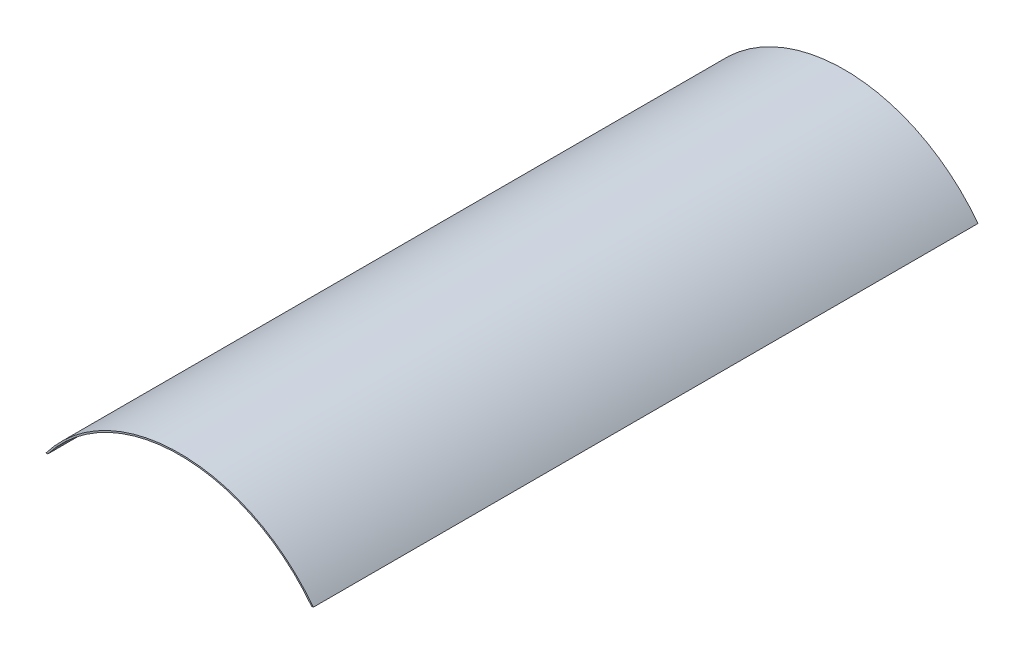
ISO-10303-21;
HEADER;
FILE_DESCRIPTION(('STEP AP214'),'2;1');
FILE_NAME('part.step','',(''),(''),'','','');
FILE_SCHEMA(('AUTOMOTIVE_DESIGN { 1 0 10303 214 1 1 1 1 }'));
ENDSEC;
DATA;
#1=APPLICATION_CONTEXT('core data for automotive mechanical design processes');
#2=APPLICATION_PROTOCOL_DEFINITION('international standard','automotive_design',2000,#1);
#3=PRODUCT_CONTEXT('',#1,'mechanical');
#4=PRODUCT('Part','Part','',(#3));
#5=PRODUCT_RELATED_PRODUCT_CATEGORY('part','',(#4));
#6=PRODUCT_DEFINITION_FORMATION('','',#4);
#7=PRODUCT_DEFINITION_CONTEXT('part definition',#1,'design');
#8=PRODUCT_DEFINITION('design','',#6,#7);
#9=PRODUCT_DEFINITION_SHAPE('','',#8);
#10=(LENGTH_UNIT() NAMED_UNIT(*) SI_UNIT(.MILLI.,.METRE.));
#11=(NAMED_UNIT(*) PLANE_ANGLE_UNIT() SI_UNIT($,.RADIAN.));
#12=(NAMED_UNIT(*) SI_UNIT($,.STERADIAN.) SOLID_ANGLE_UNIT());
#13=UNCERTAINTY_MEASURE_WITH_UNIT(LENGTH_MEASURE(1.E-05),#10,'distance_accuracy_value','');
#14=(GEOMETRIC_REPRESENTATION_CONTEXT(3) GLOBAL_UNCERTAINTY_ASSIGNED_CONTEXT((#13)) GLOBAL_UNIT_ASSIGNED_CONTEXT((#10,
#11,#12)) REPRESENTATION_CONTEXT('',''));
#15=CARTESIAN_POINT('',(0.,0.,0.));
#16=DIRECTION('',(0.,0.,1.));
#17=DIRECTION('',(1.,0.,0.));
#18=AXIS2_PLACEMENT_3D('',#15,#16,#17);
#19=CARTESIAN_POINT('',(0.,-27.3954375763557,180.));
#20=DIRECTION('',(0.,0.,-1.));
#21=DIRECTION('',(-1.,0.,0.));
#22=AXIS2_PLACEMENT_3D('',#19,#20,#21);
#23=CYLINDRICAL_SURFACE('',#22,45.);
#24=CARTESIAN_POINT('',(0.,-27.3954375763557,0.));
#25=DIRECTION('',(0.,0.,-1.));
#26=DIRECTION('',(-1.,0.,0.));
#27=AXIS2_PLACEMENT_3D('',#24,#25,#26);
#28=CIRCLE('',#27,45.);
#29=CARTESIAN_POINT('',(-35.7,0.,0.));
#30=VERTEX_POINT('',#29);
#31=CARTESIAN_POINT('',(35.7,0.,0.));
#32=VERTEX_POINT('',#31);
#33=EDGE_CURVE('E115',#30,#32,#28,.T.);
#34=ORIENTED_EDGE('',*,*,#33,.T.);
#35=DIRECTION('',(0.,0.,-1.));
#36=VECTOR('',#35,1.);
#37=CARTESIAN_POINT('',(35.7,0.,180.));
#38=LINE('',#37,#36);
#39=CARTESIAN_POINT('',(35.7,0.,180.));
#40=VERTEX_POINT('',#39);
#41=EDGE_CURVE('E11',#40,#32,#38,.T.);
#42=ORIENTED_EDGE('',*,*,#41,.F.);
#43=CARTESIAN_POINT('',(0.,-27.3954375763557,180.));
#44=DIRECTION('',(0.,0.,-1.));
#45=DIRECTION('',(-1.,0.,0.));
#46=AXIS2_PLACEMENT_3D('',#43,#44,#45);
#47=CIRCLE('',#46,45.);
#48=CARTESIAN_POINT('',(-35.7,0.,180.));
#49=VERTEX_POINT('',#48);
#50=EDGE_CURVE('E99',#49,#40,#47,.T.);
#51=ORIENTED_EDGE('',*,*,#50,.F.);
#52=DIRECTION('',(0.,0.,-1.));
#53=VECTOR('',#52,1.);
#54=CARTESIAN_POINT('',(-35.7,0.,180.));
#55=LINE('',#54,#53);
#56=EDGE_CURVE('E111',#49,#30,#55,.T.);
#57=ORIENTED_EDGE('',*,*,#56,.T.);
#58=EDGE_LOOP('',(#34,#42,#51,#57));
#59=FACE_BOUND('',#58,.T.);
#60=ADVANCED_FACE('F47',(#59),#23,.F.);
#61=CARTESIAN_POINT('',(36.2,0.,180.));
#62=DIRECTION('',(0.,1.,0.));
#63=DIRECTION('',(0.,0.,1.));
#64=AXIS2_PLACEMENT_3D('',#61,#62,#63);
#65=PLANE('',#64);
#66=DIRECTION('',(1.,0.,0.));
#67=VECTOR('',#66,1.);
#68=CARTESIAN_POINT('',(36.2,0.,0.));
#69=LINE('',#68,#67);
#70=CARTESIAN_POINT('',(36.2,0.,0.));
#71=VERTEX_POINT('',#70);
#72=EDGE_CURVE('E104',#32,#71,#69,.T.);
#73=ORIENTED_EDGE('',*,*,#72,.T.);
#74=DIRECTION('',(0.,0.,-1.));
#75=VECTOR('',#74,1.);
#76=CARTESIAN_POINT('',(36.2,0.,180.));
#77=LINE('',#76,#75);
#78=CARTESIAN_POINT('',(36.2,0.,180.));
#79=VERTEX_POINT('',#78);
#80=EDGE_CURVE('E56',#79,#71,#77,.T.);
#81=ORIENTED_EDGE('',*,*,#80,.F.);
#82=DIRECTION('',(1.,0.,0.));
#83=VECTOR('',#82,1.);
#84=CARTESIAN_POINT('',(36.2,0.,180.));
#85=LINE('',#84,#83);
#86=EDGE_CURVE('E94',#40,#79,#85,.T.);
#87=ORIENTED_EDGE('',*,*,#86,.F.);
#88=ORIENTED_EDGE('',*,*,#41,.T.);
#89=EDGE_LOOP('',(#73,#81,#87,#88));
#90=FACE_BOUND('',#89,.T.);
#91=ADVANCED_FACE('F103',(#90),#65,.F.);
#92=CARTESIAN_POINT('',(0.,-27.3954375763557,180.));
#93=DIRECTION('',(0.,0.,-1.));
#94=DIRECTION('',(-1.,0.,0.));
#95=AXIS2_PLACEMENT_3D('',#92,#93,#94);
#96=CYLINDRICAL_SURFACE('',#95,45.3976871657577);
#97=CARTESIAN_POINT('',(0.,-27.3954375763557,0.));
#98=DIRECTION('',(0.,0.,1.));
#99=DIRECTION('',(-1.,0.,0.));
#100=AXIS2_PLACEMENT_3D('',#97,#98,#99);
#101=CIRCLE('',#100,45.3976871657577);
#102=CARTESIAN_POINT('',(-36.2,0.,0.));
#103=VERTEX_POINT('',#102);
#104=EDGE_CURVE('E81',#71,#103,#101,.T.);
#105=ORIENTED_EDGE('',*,*,#104,.T.);
#106=DIRECTION('',(0.,0.,-1.));
#107=VECTOR('',#106,1.);
#108=CARTESIAN_POINT('',(-36.2,0.,180.));
#109=LINE('',#108,#107);
#110=CARTESIAN_POINT('',(-36.2,0.,180.));
#111=VERTEX_POINT('',#110);
#112=EDGE_CURVE('E106',#111,#103,#109,.T.);
#113=ORIENTED_EDGE('',*,*,#112,.F.);
#114=CARTESIAN_POINT('',(0.,-27.3954375763557,180.));
#115=DIRECTION('',(0.,0.,1.));
#116=DIRECTION('',(-1.,0.,0.));
#117=AXIS2_PLACEMENT_3D('',#114,#115,#116);
#118=CIRCLE('',#117,45.3976871657577);
#119=EDGE_CURVE('E97',#79,#111,#118,.T.);
#120=ORIENTED_EDGE('',*,*,#119,.F.);
#121=ORIENTED_EDGE('',*,*,#80,.T.);
#122=EDGE_LOOP('',(#105,#113,#120,#121));
#123=FACE_BOUND('',#122,.T.);
#124=ADVANCED_FACE('F107',(#123),#96,.T.);
#125=CARTESIAN_POINT('',(-35.7,0.,180.));
#126=DIRECTION('',(0.,1.,0.));
#127=DIRECTION('',(0.,0.,1.));
#128=AXIS2_PLACEMENT_3D('',#125,#126,#127);
#129=PLANE('',#128);
#130=DIRECTION('',(1.,0.,0.));
#131=VECTOR('',#130,1.);
#132=CARTESIAN_POINT('',(-35.7,0.,0.));
#133=LINE('',#132,#131);
#134=EDGE_CURVE('E87',#103,#30,#133,.T.);
#135=ORIENTED_EDGE('',*,*,#134,.T.);
#136=ORIENTED_EDGE('',*,*,#56,.F.);
#137=DIRECTION('',(1.,0.,0.));
#138=VECTOR('',#137,1.);
#139=CARTESIAN_POINT('',(-35.7,0.,180.));
#140=LINE('',#139,#138);
#141=EDGE_CURVE('E64',#111,#49,#140,.T.);
#142=ORIENTED_EDGE('',*,*,#141,.F.);
#143=ORIENTED_EDGE('',*,*,#112,.T.);
#144=EDGE_LOOP('',(#135,#136,#142,#143));
#145=FACE_BOUND('',#144,.T.);
#146=ADVANCED_FACE('F128',(#145),#129,.F.);
#147=CARTESIAN_POINT('',(0.,-27.3954375763557,180.));
#148=DIRECTION('',(0.,0.,-1.));
#149=DIRECTION('',(-1.,0.,0.));
#150=AXIS2_PLACEMENT_3D('',#147,#148,#149);
#151=PLANE('',#150);
#152=ORIENTED_EDGE('',*,*,#50,.T.);
#153=ORIENTED_EDGE('',*,*,#86,.T.);
#154=ORIENTED_EDGE('',*,*,#119,.T.);
#155=ORIENTED_EDGE('',*,*,#141,.T.);
#156=EDGE_LOOP('',(#152,#153,#154,#155));
#157=FACE_BOUND('',#156,.T.);
#158=ADVANCED_FACE('F95',(#157),#151,.F.);
#159=CARTESIAN_POINT('',(0.,-27.3954375763557,0.));
#160=DIRECTION('',(0.,0.,-1.));
#161=DIRECTION('',(-1.,0.,0.));
#162=AXIS2_PLACEMENT_3D('',#159,#160,#161);
#163=PLANE('',#162);
#164=ORIENTED_EDGE('',*,*,#33,.F.);
#165=ORIENTED_EDGE('',*,*,#134,.F.);
#166=ORIENTED_EDGE('',*,*,#104,.F.);
#167=ORIENTED_EDGE('',*,*,#72,.F.);
#168=EDGE_LOOP('',(#164,#165,#166,#167));
#169=FACE_BOUND('',#168,.T.);
#170=ADVANCED_FACE('F131',(#169),#163,.T.);
#171=CLOSED_SHELL('',(#60,#91,#124,#146,#158,#170));
#172=MANIFOLD_SOLID_BREP('B2',#171);
#173=ADVANCED_BREP_SHAPE_REPRESENTATION('',(#18,#172),#14);
#174=SHAPE_DEFINITION_REPRESENTATION(#9,#173);
ENDSEC;
END-ISO-10303-21;
